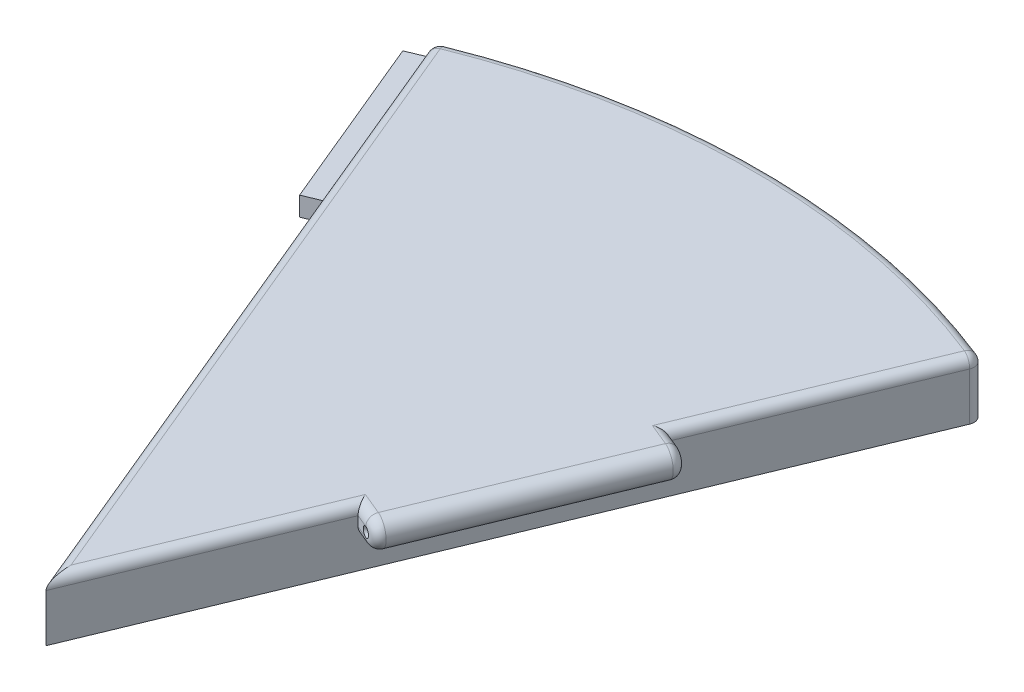
ISO-10303-21;
HEADER;
FILE_DESCRIPTION(('STEP AP214'),'2;1');
FILE_NAME('part.step','',(''),(''),'','','');
FILE_SCHEMA(('AUTOMOTIVE_DESIGN { 1 0 10303 214 1 1 1 1 }'));
ENDSEC;
DATA;
#1=APPLICATION_CONTEXT('core data for automotive mechanical design processes');
#2=APPLICATION_PROTOCOL_DEFINITION('international standard','automotive_design',2000,#1);
#3=PRODUCT_CONTEXT('',#1,'mechanical');
#4=PRODUCT('Part','Part','',(#3));
#5=PRODUCT_RELATED_PRODUCT_CATEGORY('part','',(#4));
#6=PRODUCT_DEFINITION_FORMATION('','',#4);
#7=PRODUCT_DEFINITION_CONTEXT('part definition',#1,'design');
#8=PRODUCT_DEFINITION('design','',#6,#7);
#9=PRODUCT_DEFINITION_SHAPE('','',#8);
#10=(LENGTH_UNIT() NAMED_UNIT(*) SI_UNIT(.MILLI.,.METRE.));
#11=(NAMED_UNIT(*) PLANE_ANGLE_UNIT() SI_UNIT($,.RADIAN.));
#12=(NAMED_UNIT(*) SI_UNIT($,.STERADIAN.) SOLID_ANGLE_UNIT());
#13=UNCERTAINTY_MEASURE_WITH_UNIT(LENGTH_MEASURE(1.E-05),#10,'distance_accuracy_value','');
#14=(GEOMETRIC_REPRESENTATION_CONTEXT(3) GLOBAL_UNCERTAINTY_ASSIGNED_CONTEXT((#13)) GLOBAL_UNIT_ASSIGNED_CONTEXT((#10,
#11,#12)) REPRESENTATION_CONTEXT('',''));
#15=CARTESIAN_POINT('',(0.,0.,0.));
#16=DIRECTION('',(0.,0.,1.));
#17=DIRECTION('',(1.,0.,0.));
#18=AXIS2_PLACEMENT_3D('',#15,#16,#17);
#19=CARTESIAN_POINT('',(0.,6.,0.));
#20=DIRECTION('',(-0.923461268672836,0.,0.383691653885194));
#21=DIRECTION('',(0.383691653885194,0.,0.923461268672836));
#22=AXIS2_PLACEMENT_3D('',#19,#20,#21);
#23=PLANE('',#22);
#24=DIRECTION('',(0.,1.,0.));
#25=VECTOR('',#24,1.);
#26=CARTESIAN_POINT('',(-20.7167566802569,5.,-49.8606686202791));
#27=LINE('',#26,#25);
#28=CARTESIAN_POINT('',(-20.7167566802569,3.,-49.8606686202791));
#29=VERTEX_POINT('',#28);
#30=CARTESIAN_POINT('',(-20.7167566802569,5.,-49.8606686202791));
#31=VERTEX_POINT('',#30);
#32=EDGE_CURVE('E59',#29,#31,#27,.T.);
#33=ORIENTED_EDGE('',*,*,#32,.F.);
#34=DIRECTION('',(0.383691653885194,0.,0.923461268672836));
#35=VECTOR('',#34,1.);
#36=CARTESIAN_POINT('',(-28.3905897579608,3.,-68.3298939937358));
#37=LINE('',#36,#35);
#38=CARTESIAN_POINT('',(-28.3905897579608,3.,-68.3298939937358));
#39=VERTEX_POINT('',#38);
#40=EDGE_CURVE('E462',#39,#29,#37,.T.);
#41=ORIENTED_EDGE('',*,*,#40,.F.);
#42=DIRECTION('',(0.,-1.,0.));
#43=VECTOR('',#42,1.);
#44=CARTESIAN_POINT('',(-28.3905897579608,6.,-68.3298939937358));
#45=LINE('',#44,#43);
#46=CARTESIAN_POINT('',(-28.3905897579608,0.,-68.3298939937358));
#47=VERTEX_POINT('',#46);
#48=EDGE_CURVE('E305',#39,#47,#45,.T.);
#49=ORIENTED_EDGE('',*,*,#48,.T.);
#50=DIRECTION('',(-0.383691653885194,0.,-0.923461268672836));
#51=VECTOR('',#50,1.);
#52=CARTESIAN_POINT('',(0.,0.,0.));
#53=LINE('',#52,#51);
#54=CARTESIAN_POINT('',(0.,0.,0.));
#55=VERTEX_POINT('',#54);
#56=EDGE_CURVE('E242',#55,#47,#53,.T.);
#57=ORIENTED_EDGE('',*,*,#56,.F.);
#58=DIRECTION('',(0.,-1.,0.));
#59=VECTOR('',#58,1.);
#60=CARTESIAN_POINT('',(0.,6.,0.));
#61=LINE('',#60,#59);
#62=CARTESIAN_POINT('',(0.,5.,0.));
#63=VERTEX_POINT('',#62);
#64=EDGE_CURVE('E249',#63,#55,#61,.T.);
#65=ORIENTED_EDGE('',*,*,#64,.F.);
#66=DIRECTION('',(-0.383691653885194,0.,-0.923461268672836));
#67=VECTOR('',#66,1.);
#68=CARTESIAN_POINT('',(0.,5.,0.));
#69=LINE('',#68,#67);
#70=EDGE_CURVE('E308',#63,#31,#69,.T.);
#71=ORIENTED_EDGE('',*,*,#70,.T.);
#72=EDGE_LOOP('',(#33,#41,#49,#57,#65,#71));
#73=FACE_BOUND('',#72,.T.);
#74=ADVANCED_FACE('F41',(#73),#23,.T.);
#75=CARTESIAN_POINT('',(0.,6.,0.));
#76=DIRECTION('',(0.,1.,0.));
#77=DIRECTION('',(0.,0.,1.));
#78=AXIS2_PLACEMENT_3D('',#75,#76,#77);
#79=PLANE('',#78);
#80=DIRECTION('',(-0.381674754894794,0.,0.924296695588597));
#81=VECTOR('',#80,1.);
#82=CARTESIAN_POINT('',(20.4701827881226,6.,-45.6423226470877));
#83=LINE('',#82,#81);
#84=CARTESIAN_POINT('',(20.0885080332278,6.,-44.7180259514991));
#85=VERTEX_POINT('',#84);
#86=CARTESIAN_POINT('',(11.3099886706475,6.,-23.4592019529613));
#87=VERTEX_POINT('',#86);
#88=EDGE_CURVE('E208',#85,#87,#83,.T.);
#89=ORIENTED_EDGE('',*,*,#88,.F.);
#90=DIRECTION('',(-0.924296695588597,0.,-0.381674754894794));
#91=VECTOR('',#90,1.);
#92=CARTESIAN_POINT('',(18.7020629898449,6.,-45.2905380838412));
#93=LINE('',#92,#91);
#94=CARTESIAN_POINT('',(17.7777662942563,6.,-45.672212838736));
#95=VERTEX_POINT('',#94);
#96=EDGE_CURVE('E302',#85,#95,#93,.T.);
#97=ORIENTED_EDGE('',*,*,#96,.T.);
#98=DIRECTION('',(-0.381674754894793,0.,0.924296695588597));
#99=VECTOR('',#98,1.);
#100=CARTESIAN_POINT('',(-0.924296695588594,6.,-0.381674754894792));
#101=LINE('',#100,#99);
#102=CARTESIAN_POINT('',(27.3170561654006,6.,-68.7733846953627));
#103=VERTEX_POINT('',#102);
#104=EDGE_CURVE('E299',#95,#103,#101,.F.);
#105=ORIENTED_EDGE('',*,*,#104,.T.);
#106=CARTESIAN_POINT('',(0.,6.,0.));
#107=DIRECTION('',(0.,1.,0.));
#108=DIRECTION('',(0.,0.,1.));
#109=AXIS2_PLACEMENT_3D('',#106,#107,#108);
#110=CIRCLE('',#109,73.9999999999999);
#111=CARTESIAN_POINT('',(-27.4671284892879,6.,-68.713585647621));
#112=VERTEX_POINT('',#111);
#113=EDGE_CURVE('E296',#103,#112,#110,.T.);
#114=ORIENTED_EDGE('',*,*,#113,.T.);
#115=DIRECTION('',(-0.383691653885194,0.,-0.923461268672836));
#116=VECTOR('',#115,1.);
#117=CARTESIAN_POINT('',(0.923461268672836,6.,-0.383691653885194));
#118=LINE('',#117,#116);
#119=CARTESIAN_POINT('',(-0.0028523259061616,6.,-2.61312437304142));
#120=VERTEX_POINT('',#119);
#121=EDGE_CURVE('E293',#112,#120,#118,.F.);
#122=ORIENTED_EDGE('',*,*,#121,.T.);
#123=DIRECTION('',(-0.381674754894793,0.,0.924296695588597));
#124=VECTOR('',#123,1.);
#125=CARTESIAN_POINT('',(-0.924296695588598,6.,-0.381674754894794));
#126=LINE('',#125,#124);
#127=CARTESIAN_POINT('',(8.99924693167603,6.,-24.4133888401983));
#128=VERTEX_POINT('',#127);
#129=EDGE_CURVE('E290',#120,#128,#126,.F.);
#130=ORIENTED_EDGE('',*,*,#129,.T.);
#131=DIRECTION('',(-0.924296695588597,0.,-0.381674754894794));
#132=VECTOR('',#131,1.);
#133=CARTESIAN_POINT('',(11.3099886706475,6.,-23.4592019529613));
#134=LINE('',#133,#132);
#135=EDGE_CURVE('E287',#128,#87,#134,.F.);
#136=ORIENTED_EDGE('',*,*,#135,.T.);
#137=EDGE_LOOP('',(#89,#97,#105,#114,#122,#130,#136));
#138=FACE_BOUND('',#137,.T.);
#139=ADVANCED_FACE('F413',(#138),#79,.T.);
#140=CARTESIAN_POINT('',(12.3147589591356,3.,-21.9623931250305));
#141=DIRECTION('',(0.,1.,0.));
#142=DIRECTION('',(0.,0.,1.));
#143=AXIS2_PLACEMENT_3D('',#140,#141,#142);
#144=PLANE('',#143);
#145=DIRECTION('',(0.381674754894794,0.,-0.924296695588597));
#146=VECTOR('',#145,1.);
#147=CARTESIAN_POINT('',(9.54186887236984,3.,-23.1074173897149));
#148=LINE('',#147,#146);
#149=CARTESIAN_POINT('',(9.92354362726463,3.,-24.0317140853035));
#150=VERTEX_POINT('',#149);
#151=CARTESIAN_POINT('',(18.7020629898449,3.,-45.2905380838412));
#152=VERTEX_POINT('',#151);
#153=EDGE_CURVE('E230',#150,#152,#148,.T.);
#154=ORIENTED_EDGE('',*,*,#153,.T.);
#155=DIRECTION('',(-0.924296695588597,0.,-0.381674754894794));
#156=VECTOR('',#155,1.);
#157=CARTESIAN_POINT('',(21.4749530766107,3.,-44.1455138191569));
#158=LINE('',#157,#156);
#159=CARTESIAN_POINT('',(20.0885080332278,3.,-44.7180259514991));
#160=VERTEX_POINT('',#159);
#161=EDGE_CURVE('E263',#152,#160,#158,.F.);
#162=ORIENTED_EDGE('',*,*,#161,.T.);
#163=DIRECTION('',(-0.381674754894794,0.,0.924296695588597));
#164=VECTOR('',#163,1.);
#165=CARTESIAN_POINT('',(20.4701827881226,3.,-45.6423226470877));
#166=LINE('',#165,#164);
#167=CARTESIAN_POINT('',(11.3099886706475,3.,-23.4592019529613));
#168=VERTEX_POINT('',#167);
#169=EDGE_CURVE('E213',#160,#168,#166,.T.);
#170=ORIENTED_EDGE('',*,*,#169,.T.);
#171=DIRECTION('',(-0.924296695588597,0.,-0.381674754894794));
#172=VECTOR('',#171,1.);
#173=CARTESIAN_POINT('',(12.6964337140304,3.,-22.8866898206191));
#174=LINE('',#173,#172);
#175=EDGE_CURVE('E260',#168,#150,#174,.T.);
#176=ORIENTED_EDGE('',*,*,#175,.T.);
#177=EDGE_LOOP('',(#154,#162,#170,#176));
#178=FACE_BOUND('',#177,.T.);
#179=ADVANCED_FACE('F386',(#178),#144,.F.);
#180=CARTESIAN_POINT('',(0.,6.,0.));
#181=DIRECTION('',(0.924296695588597,0.,0.381674754894793));
#182=DIRECTION('',(0.381674754894793,0.,-0.924296695588597));
#183=AXIS2_PLACEMENT_3D('',#180,#181,#182);
#184=PLANE('',#183);
#185=DIRECTION('',(0.,-1.,0.));
#186=VECTOR('',#185,1.);
#187=CARTESIAN_POINT('',(9.54186887236984,6.,-23.1074173897149));
#188=LINE('',#187,#186);
#189=CARTESIAN_POINT('',(9.54186887236984,5.,-23.1074173897149));
#190=VERTEX_POINT('',#189);
#191=CARTESIAN_POINT('',(9.54186887236984,4.,-23.1074173897149));
#192=VERTEX_POINT('',#191);
#193=EDGE_CURVE('E221',#190,#192,#188,.T.);
#194=ORIENTED_EDGE('',*,*,#193,.F.);
#195=DIRECTION('',(-0.381674754894793,0.,0.924296695588597));
#196=VECTOR('',#195,1.);
#197=CARTESIAN_POINT('',(0.,5.,0.));
#198=LINE('',#197,#196);
#199=EDGE_CURVE('E284',#190,#63,#198,.T.);
#200=ORIENTED_EDGE('',*,*,#199,.T.);
#201=ORIENTED_EDGE('',*,*,#64,.T.);
#202=DIRECTION('',(-0.381674754894793,0.,0.924296695588597));
#203=VECTOR('',#202,1.);
#204=CARTESIAN_POINT('',(0.,0.,0.));
#205=LINE('',#204,#203);
#206=CARTESIAN_POINT('',(28.2413528609892,0.,-68.3917099404679));
#207=VERTEX_POINT('',#206);
#208=EDGE_CURVE('E246',#207,#55,#205,.T.);
#209=ORIENTED_EDGE('',*,*,#208,.F.);
#210=DIRECTION('',(0.,-1.,0.));
#211=VECTOR('',#210,1.);
#212=CARTESIAN_POINT('',(28.2413528609892,6.,-68.3917099404679));
#213=LINE('',#212,#211);
#214=CARTESIAN_POINT('',(28.2413528609892,5.,-68.3917099404679));
#215=VERTEX_POINT('',#214);
#216=EDGE_CURVE('E278',#207,#215,#213,.F.);
#217=ORIENTED_EDGE('',*,*,#216,.T.);
#218=DIRECTION('',(-0.381674754894793,0.,0.924296695588597));
#219=VECTOR('',#218,1.);
#220=CARTESIAN_POINT('',(0.,5.,0.));
#221=LINE('',#220,#219);
#222=CARTESIAN_POINT('',(19.0837377447397,5.,-46.2148347794298));
#223=VERTEX_POINT('',#222);
#224=EDGE_CURVE('E281',#215,#223,#221,.T.);
#225=ORIENTED_EDGE('',*,*,#224,.T.);
#226=DIRECTION('',(0.,1.,0.));
#227=VECTOR('',#226,1.);
#228=CARTESIAN_POINT('',(19.0837377447397,6.,-46.2148347794298));
#229=LINE('',#228,#227);
#230=CARTESIAN_POINT('',(19.0837377447397,4.,-46.2148347794298));
#231=VERTEX_POINT('',#230);
#232=EDGE_CURVE('E234',#231,#223,#229,.T.);
#233=ORIENTED_EDGE('',*,*,#232,.F.);
#234=CARTESIAN_POINT('',(18.7020629898449,4.,-45.2905380838412));
#235=DIRECTION('',(0.924296695588597,0.,0.381674754894793));
#236=DIRECTION('',(0.381674754894793,0.,-0.924296695588597));
#237=AXIS2_PLACEMENT_3D('',#234,#235,#236);
#238=CIRCLE('',#237,1.);
#239=EDGE_CURVE('E51',#231,#152,#238,.F.);
#240=ORIENTED_EDGE('',*,*,#239,.T.);
#241=ORIENTED_EDGE('',*,*,#153,.F.);
#242=CARTESIAN_POINT('',(9.92354362726463,4.,-24.0317140853035));
#243=DIRECTION('',(0.924296695588597,0.,0.381674754894793));
#244=DIRECTION('',(0.381674754894793,0.,-0.924296695588597));
#245=AXIS2_PLACEMENT_3D('',#242,#243,#244);
#246=CIRCLE('',#245,1.);
#247=EDGE_CURVE('E11',#150,#192,#246,.F.);
#248=ORIENTED_EDGE('',*,*,#247,.T.);
#249=EDGE_LOOP('',(#194,#200,#201,#209,#217,#225,#233,#240,#241,#248));
#250=FACE_BOUND('',#249,.T.);
#251=ADVANCED_FACE('F391',(#250),#184,.T.);
#252=CARTESIAN_POINT('',(0.,6.,0.));
#253=DIRECTION('',(0.,-1.,0.));
#254=DIRECTION('',(0.,0.,-1.));
#255=AXIS2_PLACEMENT_3D('',#252,#253,#254);
#256=CYLINDRICAL_SURFACE('',#255,74.9999999999999);
#257=CARTESIAN_POINT('',(0.,5.,0.));
#258=DIRECTION('',(0.,1.,0.));
#259=DIRECTION('',(0.,0.,1.));
#260=AXIS2_PLACEMENT_3D('',#257,#258,#259);
#261=CIRCLE('',#260,74.9999999999999);
#262=CARTESIAN_POINT('',(-27.8383059013054,5.,-69.6421476158321));
#263=VERTEX_POINT('',#262);
#264=CARTESIAN_POINT('',(27.6862055730412,5.,-69.7027547588136));
#265=VERTEX_POINT('',#264);
#266=EDGE_CURVE('E314',#263,#265,#261,.F.);
#267=ORIENTED_EDGE('',*,*,#266,.T.);
#268=DIRECTION('',(0.,-1.,0.));
#269=VECTOR('',#268,1.);
#270=CARTESIAN_POINT('',(27.6862055730412,6.,-69.7027547588136));
#271=LINE('',#270,#269);
#272=CARTESIAN_POINT('',(27.6862055730412,0.,-69.7027547588136));
#273=VERTEX_POINT('',#272);
#274=EDGE_CURVE('E317',#265,#273,#271,.T.);
#275=ORIENTED_EDGE('',*,*,#274,.T.);
#276=CARTESIAN_POINT('',(0.,0.,0.));
#277=DIRECTION('',(0.,1.,0.));
#278=DIRECTION('',(0.,0.,1.));
#279=AXIS2_PLACEMENT_3D('',#276,#277,#278);
#280=CIRCLE('',#279,74.9999999999999);
#281=CARTESIAN_POINT('',(-27.8383059013054,0.,-69.6421476158321));
#282=VERTEX_POINT('',#281);
#283=EDGE_CURVE('E238',#282,#273,#280,.F.);
#284=ORIENTED_EDGE('',*,*,#283,.F.);
#285=DIRECTION('',(0.,-1.,0.));
#286=VECTOR('',#285,1.);
#287=CARTESIAN_POINT('',(-27.8383059013054,6.,-69.6421476158321));
#288=LINE('',#287,#286);
#289=EDGE_CURVE('E311',#282,#263,#288,.F.);
#290=ORIENTED_EDGE('',*,*,#289,.T.);
#291=EDGE_LOOP('',(#267,#275,#284,#290));
#292=FACE_BOUND('',#291,.T.);
#293=ADVANCED_FACE('F438',(#292),#256,.T.);
#294=CARTESIAN_POINT('',(0.,0.,0.));
#295=DIRECTION('',(0.,1.,0.));
#296=DIRECTION('',(0.,0.,1.));
#297=AXIS2_PLACEMENT_3D('',#294,#295,#296);
#298=PLANE('',#297);
#299=ORIENTED_EDGE('',*,*,#283,.T.);
#300=CARTESIAN_POINT('',(27.3170561654006,0.,-68.7733846953627));
#301=DIRECTION('',(0.,1.,0.));
#302=DIRECTION('',(0.,0.,1.));
#303=AXIS2_PLACEMENT_3D('',#300,#301,#302);
#304=CIRCLE('',#303,1.);
#305=EDGE_CURVE('E323',#273,#207,#304,.F.);
#306=ORIENTED_EDGE('',*,*,#305,.T.);
#307=ORIENTED_EDGE('',*,*,#208,.T.);
#308=ORIENTED_EDGE('',*,*,#56,.T.);
#309=CARTESIAN_POINT('',(-27.4671284892879,0.,-68.713585647621));
#310=DIRECTION('',(0.,1.,0.));
#311=DIRECTION('',(0.,0.,1.));
#312=AXIS2_PLACEMENT_3D('',#309,#310,#311);
#313=CIRCLE('',#312,1.);
#314=EDGE_CURVE('E320',#47,#282,#313,.F.);
#315=ORIENTED_EDGE('',*,*,#314,.T.);
#316=EDGE_LOOP('',(#299,#306,#307,#308,#315));
#317=FACE_BOUND('',#316,.T.);
#318=ADVANCED_FACE('F441',(#317),#298,.F.);
#319=CARTESIAN_POINT('',(12.3147589591356,6.,-21.9623931250305));
#320=DIRECTION('',(0.381674754894794,0.,-0.924296695588597));
#321=DIRECTION('',(-0.924296695588597,0.,-0.381674754894794));
#322=AXIS2_PLACEMENT_3D('',#319,#320,#321);
#323=PLANE('',#322);
#324=ORIENTED_EDGE('',*,*,#193,.T.);
#325=DIRECTION('',(-0.924296695588597,0.,-0.381674754894794));
#326=VECTOR('',#325,1.);
#327=CARTESIAN_POINT('',(12.3147589591356,4.,-21.9623931250305));
#328=LINE('',#327,#326);
#329=CARTESIAN_POINT('',(10.9283139157527,4.,-22.5349052573727));
#330=VERTEX_POINT('',#329);
#331=EDGE_CURVE('E275',#192,#330,#328,.F.);
#332=ORIENTED_EDGE('',*,*,#331,.T.);
#333=CARTESIAN_POINT('',(10.9283139157527,4.5,-22.5349052573727));
#334=DIRECTION('',(-0.381674754894794,0.,0.924296695588597));
#335=DIRECTION('',(0.924296695588597,0.,0.381674754894794));
#336=AXIS2_PLACEMENT_3D('',#333,#334,#335);
#337=CIRCLE('',#336,0.5);
#338=CARTESIAN_POINT('',(10.9283139157527,5.,-22.5349052573727));
#339=VERTEX_POINT('',#338);
#340=EDGE_CURVE('E223',#339,#330,#337,.T.);
#341=ORIENTED_EDGE('',*,*,#340,.F.);
#342=DIRECTION('',(-0.924296695588597,0.,-0.381674754894794));
#343=VECTOR('',#342,1.);
#344=CARTESIAN_POINT('',(9.54186887236984,5.,-23.1074173897149));
#345=LINE('',#344,#343);
#346=EDGE_CURVE('E272',#339,#190,#345,.T.);
#347=ORIENTED_EDGE('',*,*,#346,.T.);
#348=EDGE_LOOP('',(#324,#332,#341,#347));
#349=FACE_BOUND('',#348,.T.);
#350=ADVANCED_FACE('F460',(#349),#323,.F.);
#351=CARTESIAN_POINT('',(21.8566278315055,6.,-45.0698105147455));
#352=DIRECTION('',(-0.381674754894794,0.,0.924296695588597));
#353=DIRECTION('',(0.924296695588597,0.,0.381674754894794));
#354=AXIS2_PLACEMENT_3D('',#351,#352,#353);
#355=PLANE('',#354);
#356=CARTESIAN_POINT('',(20.4701827881226,4.5,-45.6423226470877));
#357=DIRECTION('',(-0.381674754894794,0.,0.924296695588597));
#358=DIRECTION('',(0.924296695588597,0.,0.381674754894794));
#359=AXIS2_PLACEMENT_3D('',#356,#357,#358);
#360=CIRCLE('',#359,0.5);
#361=CARTESIAN_POINT('',(20.4701827881226,5.,-45.6423226470877));
#362=VERTEX_POINT('',#361);
#363=CARTESIAN_POINT('',(20.4701827881226,4.,-45.6423226470877));
#364=VERTEX_POINT('',#363);
#365=EDGE_CURVE('E217',#362,#364,#360,.T.);
#366=ORIENTED_EDGE('',*,*,#365,.T.);
#367=DIRECTION('',(-0.924296695588597,0.,-0.381674754894794));
#368=VECTOR('',#367,1.);
#369=CARTESIAN_POINT('',(21.8566278315055,4.,-45.0698105147455));
#370=LINE('',#369,#368);
#371=EDGE_CURVE('E256',#364,#231,#370,.T.);
#372=ORIENTED_EDGE('',*,*,#371,.T.);
#373=ORIENTED_EDGE('',*,*,#232,.T.);
#374=DIRECTION('',(-0.924296695588597,0.,-0.381674754894794));
#375=VECTOR('',#374,1.);
#376=CARTESIAN_POINT('',(20.4701827881226,5.,-45.6423226470877));
#377=LINE('',#376,#375);
#378=EDGE_CURVE('E253',#223,#362,#377,.F.);
#379=ORIENTED_EDGE('',*,*,#378,.T.);
#380=EDGE_LOOP('',(#366,#372,#373,#379));
#381=FACE_BOUND('',#380,.T.);
#382=ADVANCED_FACE('F397',(#381),#355,.F.);
#383=CARTESIAN_POINT('',(20.4701827881226,4.5,-45.6423226470877));
#384=DIRECTION('',(-0.381674754894794,0.,0.924296695588597));
#385=DIRECTION('',(0.924296695588597,0.,0.381674754894794));
#386=AXIS2_PLACEMENT_3D('',#383,#384,#385);
#387=CYLINDRICAL_SURFACE('',#386,0.5);
#388=ORIENTED_EDGE('',*,*,#365,.F.);
#389=EDGE_CURVE('E222',#364,#362,#360,.T.);
#390=ORIENTED_EDGE('',*,*,#389,.F.);
#391=EDGE_LOOP('',(#388,#390));
#392=FACE_BOUND('',#391,.T.);
#393=ORIENTED_EDGE('',*,*,#340,.T.);
#394=EDGE_CURVE('E212',#330,#339,#337,.T.);
#395=ORIENTED_EDGE('',*,*,#394,.T.);
#396=EDGE_LOOP('',(#393,#395));
#397=FACE_BOUND('',#396,.T.);
#398=ADVANCED_FACE('F467',(#392,#397),#387,.F.);
#399=CARTESIAN_POINT('',(20.4701827881226,4.5,-45.6423226470877));
#400=DIRECTION('',(-0.381674754894794,0.,0.924296695588597));
#401=DIRECTION('',(0.924296695588597,0.,0.381674754894794));
#402=AXIS2_PLACEMENT_3D('',#399,#400,#401);
#403=CYLINDRICAL_SURFACE('',#402,1.5);
#404=ORIENTED_EDGE('',*,*,#169,.F.);
#405=CARTESIAN_POINT('',(20.0885080332278,4.5,-44.7180259514991));
#406=DIRECTION('',(-0.381674754894794,0.,0.924296695588597));
#407=DIRECTION('',(0.924296695588597,0.,0.381674754894794));
#408=AXIS2_PLACEMENT_3D('',#405,#406,#407);
#409=CIRCLE('',#408,1.5);
#410=EDGE_CURVE('E269',#160,#85,#409,.T.);
#411=ORIENTED_EDGE('',*,*,#410,.T.);
#412=ORIENTED_EDGE('',*,*,#88,.T.);
#413=CARTESIAN_POINT('',(11.3099886706475,4.5,-23.4592019529613));
#414=DIRECTION('',(0.381674754894794,0.,-0.924296695588597));
#415=DIRECTION('',(-0.924296695588597,0.,-0.381674754894794));
#416=AXIS2_PLACEMENT_3D('',#413,#414,#415);
#417=CIRCLE('',#416,1.5);
#418=EDGE_CURVE('E266',#87,#168,#417,.T.);
#419=ORIENTED_EDGE('',*,*,#418,.T.);
#420=EDGE_LOOP('',(#404,#411,#412,#419));
#421=FACE_BOUND('',#420,.T.);
#422=ADVANCED_FACE('F410',(#421),#403,.T.);
#423=CARTESIAN_POINT('',(12.6964337140304,4.,-22.8866898206191));
#424=DIRECTION('',(-0.924296695588597,0.,-0.381674754894794));
#425=DIRECTION('',(-0.381674754894794,0.,0.924296695588597));
#426=AXIS2_PLACEMENT_3D('',#423,#424,#425);
#427=CYLINDRICAL_SURFACE('',#426,1.);
#428=ORIENTED_EDGE('',*,*,#247,.F.);
#429=ORIENTED_EDGE('',*,*,#175,.F.);
#430=CARTESIAN_POINT('',(11.3099886706475,4.,-23.4592019529613));
#431=DIRECTION('',(0.924296695588597,0.,0.381674754894792));
#432=DIRECTION('',(0.381674754894792,0.,-0.924296695588597));
#433=AXIS2_PLACEMENT_3D('',#430,#431,#432);
#434=CIRCLE('',#433,1.);
#435=EDGE_CURVE('E45',#330,#168,#434,.T.);
#436=ORIENTED_EDGE('',*,*,#435,.F.);
#437=ORIENTED_EDGE('',*,*,#331,.F.);
#438=EDGE_LOOP('',(#428,#429,#436,#437));
#439=FACE_BOUND('',#438,.T.);
#440=ADVANCED_FACE('F43',(#439),#427,.T.);
#441=CARTESIAN_POINT('',(11.3099886706475,4.5,-23.4592019529613));
#442=DIRECTION('',(0.381674754894794,0.,-0.924296695588597));
#443=DIRECTION('',(-0.924296695588597,0.,-0.381674754894794));
#444=AXIS2_PLACEMENT_3D('',#441,#442,#443);
#445=DEGENERATE_TOROIDAL_SURFACE('',#444,0.5,1.,.T.);
#446=ORIENTED_EDGE('',*,*,#435,.T.);
#447=ORIENTED_EDGE('',*,*,#418,.F.);
#448=CARTESIAN_POINT('',(11.3099886706475,5.,-23.4592019529613));
#449=DIRECTION('',(-0.924296695588597,0.,-0.381674754894793));
#450=DIRECTION('',(-0.381674754894794,0.,0.924296695588597));
#451=AXIS2_PLACEMENT_3D('',#448,#449,#450);
#452=CIRCLE('',#451,1.);
#453=EDGE_CURVE('E366',#339,#87,#452,.T.);
#454=ORIENTED_EDGE('',*,*,#453,.F.);
#455=ORIENTED_EDGE('',*,*,#394,.F.);
#456=EDGE_LOOP('',(#446,#447,#454,#455));
#457=FACE_BOUND('',#456,.T.);
#458=ADVANCED_FACE('F379',(#457),#445,.T.);
#459=CARTESIAN_POINT('',(12.6964337140304,5.,-22.8866898206191));
#460=DIRECTION('',(0.924296695588597,0.,0.381674754894794));
#461=DIRECTION('',(0.381674754894794,0.,-0.924296695588597));
#462=AXIS2_PLACEMENT_3D('',#459,#460,#461);
#463=CYLINDRICAL_SURFACE('',#462,1.);
#464=ORIENTED_EDGE('',*,*,#453,.T.);
#465=ORIENTED_EDGE('',*,*,#135,.F.);
#466=CARTESIAN_POINT('',(8.99924693167603,5.,-24.4133888401983));
#467=DIRECTION('',(-0.923461268672837,0.,0.383691653885193));
#468=DIRECTION('',(0.383691653885193,0.,0.923461268672837));
#469=AXIS2_PLACEMENT_3D('',#466,#467,#468);
#470=ELLIPSE('',#469,1.4142135623731,1.);
#471=EDGE_CURVE('E363',#190,#128,#470,.T.);
#472=ORIENTED_EDGE('',*,*,#471,.F.);
#473=ORIENTED_EDGE('',*,*,#346,.F.);
#474=EDGE_LOOP('',(#464,#465,#472,#473));
#475=FACE_BOUND('',#474,.T.);
#476=ADVANCED_FACE('F457',(#475),#463,.T.);
#477=CARTESIAN_POINT('',(-0.924296695588597,5.,-0.381674754894793));
#478=DIRECTION('',(-0.381674754894793,0.,0.924296695588597));
#479=DIRECTION('',(0.924296695588597,0.,0.381674754894793));
#480=AXIS2_PLACEMENT_3D('',#477,#478,#479);
#481=CYLINDRICAL_SURFACE('',#480,1.);
#482=ORIENTED_EDGE('',*,*,#471,.T.);
#483=ORIENTED_EDGE('',*,*,#129,.F.);
#484=CARTESIAN_POINT('',(-0.00285232590616134,5.,-2.61312437304142));
#485=DIRECTION('',(-0.999999404272364,0.,0.00109153786799378));
#486=DIRECTION('',(-0.00109153786799375,0.,-0.999999404272364));
#487=AXIS2_PLACEMENT_3D('',#484,#485,#486);
#488=ELLIPSE('',#487,2.61312592975275,1.);
#489=EDGE_CURVE('E359',#63,#120,#488,.T.);
#490=ORIENTED_EDGE('',*,*,#489,.F.);
#491=ORIENTED_EDGE('',*,*,#199,.F.);
#492=EDGE_LOOP('',(#482,#483,#490,#491));
#493=FACE_BOUND('',#492,.T.);
#494=ADVANCED_FACE('F454',(#493),#481,.T.);
#495=CARTESIAN_POINT('',(0.923461268672836,5.,-0.383691653885194));
#496=DIRECTION('',(-0.383691653885194,0.,-0.923461268672836));
#497=DIRECTION('',(-0.923461268672836,0.,0.383691653885194));
#498=AXIS2_PLACEMENT_3D('',#495,#496,#497);
#499=CYLINDRICAL_SURFACE('',#498,1.);
#500=ORIENTED_EDGE('',*,*,#489,.T.);
#501=ORIENTED_EDGE('',*,*,#121,.F.);
#502=CARTESIAN_POINT('',(-27.4671284892879,5.,-68.713585647621));
#503=DIRECTION('',(-0.383691653885188,0.,-0.923461268672839));
#504=DIRECTION('',(-0.923461268672839,0.,0.383691653885188));
#505=AXIS2_PLACEMENT_3D('',#502,#503,#504);
#506=CIRCLE('',#505,1.);
#507=CARTESIAN_POINT('',(-28.3905897579608,5.,-68.3298939937358));
#508=VERTEX_POINT('',#507);
#509=EDGE_CURVE('E355',#508,#112,#506,.T.);
#510=ORIENTED_EDGE('',*,*,#509,.F.);
#511=DIRECTION('',(-0.383691653885194,0.,-0.923461268672836));
#512=VECTOR('',#511,1.);
#513=CARTESIAN_POINT('',(-28.3905897579608,5.,-68.3298939937358));
#514=LINE('',#513,#512);
#515=EDGE_CURVE('E67',#31,#508,#514,.T.);
#516=ORIENTED_EDGE('',*,*,#515,.F.);
#517=ORIENTED_EDGE('',*,*,#70,.F.);
#518=EDGE_LOOP('',(#500,#501,#510,#516,#517));
#519=FACE_BOUND('',#518,.T.);
#520=ADVANCED_FACE('F450',(#519),#499,.T.);
#521=CARTESIAN_POINT('',(-27.4671284892879,6.,-68.713585647621));
#522=DIRECTION('',(0.,-1.,0.));
#523=DIRECTION('',(0.,0.,-1.));
#524=AXIS2_PLACEMENT_3D('',#521,#522,#523);
#525=CYLINDRICAL_SURFACE('',#524,1.);
#526=ORIENTED_EDGE('',*,*,#314,.F.);
#527=ORIENTED_EDGE('',*,*,#48,.F.);
#528=EDGE_CURVE('E195',#508,#39,#45,.T.);
#529=ORIENTED_EDGE('',*,*,#528,.F.);
#530=CARTESIAN_POINT('',(-27.4671284892879,5.,-68.713585647621));
#531=DIRECTION('',(0.,1.,0.));
#532=DIRECTION('',(0.,0.,1.));
#533=AXIS2_PLACEMENT_3D('',#530,#531,#532);
#534=CIRCLE('',#533,1.);
#535=EDGE_CURVE('E351',#263,#508,#534,.T.);
#536=ORIENTED_EDGE('',*,*,#535,.F.);
#537=ORIENTED_EDGE('',*,*,#289,.F.);
#538=EDGE_LOOP('',(#526,#527,#529,#536,#537));
#539=FACE_BOUND('',#538,.T.);
#540=ADVANCED_FACE('F446',(#539),#525,.T.);
#541=CARTESIAN_POINT('',(-27.4671284892879,5.,-68.713585647621));
#542=DIRECTION('',(0.,0.,1.));
#543=DIRECTION('',(1.,0.,0.));
#544=AXIS2_PLACEMENT_3D('',#541,#542,#543);
#545=SPHERICAL_SURFACE('',#544,1.);
#546=ORIENTED_EDGE('',*,*,#535,.T.);
#547=ORIENTED_EDGE('',*,*,#509,.T.);
#548=CARTESIAN_POINT('',(-27.4671284892879,5.,-68.713585647621));
#549=DIRECTION('',(-0.928561968211096,0.,0.371177412017401));
#550=DIRECTION('',(0.371177412017401,0.,0.928561968211096));
#551=AXIS2_PLACEMENT_3D('',#548,#549,#550);
#552=CIRCLE('',#551,1.);
#553=EDGE_CURVE('E347',#263,#112,#552,.F.);
#554=ORIENTED_EDGE('',*,*,#553,.F.);
#555=EDGE_LOOP('',(#546,#547,#554));
#556=FACE_BOUND('',#555,.T.);
#557=ADVANCED_FACE('F449',(#556),#545,.T.);
#558=CARTESIAN_POINT('',(0.,5.,0.));
#559=DIRECTION('',(0.,1.,0.));
#560=DIRECTION('',(0.,0.,1.));
#561=AXIS2_PLACEMENT_3D('',#558,#559,#560);
#562=TOROIDAL_SURFACE('',#561,73.9999999999999,1.);
#563=ORIENTED_EDGE('',*,*,#553,.T.);
#564=ORIENTED_EDGE('',*,*,#113,.F.);
#565=CARTESIAN_POINT('',(27.3170561654006,5.,-68.7733846953627));
#566=DIRECTION('',(0.929370063450846,0.,0.369149407640551));
#567=DIRECTION('',(0.369149407640551,0.,-0.929370063450846));
#568=AXIS2_PLACEMENT_3D('',#565,#566,#567);
#569=CIRCLE('',#568,1.);
#570=EDGE_CURVE('E343',#265,#103,#569,.T.);
#571=ORIENTED_EDGE('',*,*,#570,.F.);
#572=ORIENTED_EDGE('',*,*,#266,.F.);
#573=EDGE_LOOP('',(#563,#564,#571,#572));
#574=FACE_BOUND('',#573,.T.);
#575=ADVANCED_FACE('F425',(#574),#562,.T.);
#576=CARTESIAN_POINT('',(27.3170561654006,6.,-68.7733846953627));
#577=DIRECTION('',(0.,-1.,0.));
#578=DIRECTION('',(0.,0.,-1.));
#579=AXIS2_PLACEMENT_3D('',#576,#577,#578);
#580=CYLINDRICAL_SURFACE('',#579,1.);
#581=ORIENTED_EDGE('',*,*,#305,.F.);
#582=ORIENTED_EDGE('',*,*,#274,.F.);
#583=CARTESIAN_POINT('',(27.3170561654006,5.,-68.7733846953627));
#584=DIRECTION('',(0.,1.,0.));
#585=DIRECTION('',(0.,0.,1.));
#586=AXIS2_PLACEMENT_3D('',#583,#584,#585);
#587=CIRCLE('',#586,1.);
#588=EDGE_CURVE('E339',#215,#265,#587,.T.);
#589=ORIENTED_EDGE('',*,*,#588,.F.);
#590=ORIENTED_EDGE('',*,*,#216,.F.);
#591=EDGE_LOOP('',(#581,#582,#589,#590));
#592=FACE_BOUND('',#591,.T.);
#593=ADVANCED_FACE('F435',(#592),#580,.T.);
#594=CARTESIAN_POINT('',(27.3170561654006,5.,-68.7733846953627));
#595=DIRECTION('',(0.,0.,1.));
#596=DIRECTION('',(1.,0.,0.));
#597=AXIS2_PLACEMENT_3D('',#594,#595,#596);
#598=SPHERICAL_SURFACE('',#597,1.);
#599=ORIENTED_EDGE('',*,*,#588,.T.);
#600=ORIENTED_EDGE('',*,*,#570,.T.);
#601=CARTESIAN_POINT('',(27.3170561654006,5.,-68.7733846953627));
#602=DIRECTION('',(0.381674754894798,0.,-0.924296695588595));
#603=DIRECTION('',(-0.924296695588595,0.,-0.381674754894798));
#604=AXIS2_PLACEMENT_3D('',#601,#602,#603);
#605=CIRCLE('',#604,1.);
#606=EDGE_CURVE('E335',#215,#103,#605,.F.);
#607=ORIENTED_EDGE('',*,*,#606,.F.);
#608=EDGE_LOOP('',(#599,#600,#607));
#609=FACE_BOUND('',#608,.T.);
#610=ADVANCED_FACE('F429',(#609),#598,.T.);
#611=CARTESIAN_POINT('',(-0.924296695588597,5.,-0.381674754894793));
#612=DIRECTION('',(-0.381674754894793,0.,0.924296695588597));
#613=DIRECTION('',(0.924296695588597,0.,0.381674754894793));
#614=AXIS2_PLACEMENT_3D('',#611,#612,#613);
#615=CYLINDRICAL_SURFACE('',#614,1.);
#616=ORIENTED_EDGE('',*,*,#606,.T.);
#617=ORIENTED_EDGE('',*,*,#104,.F.);
#618=CARTESIAN_POINT('',(17.7777662942563,5.,-45.672212838736));
#619=DIRECTION('',(0.383691653885193,0.,0.923461268672837));
#620=DIRECTION('',(-0.923461268672837,0.,0.383691653885193));
#621=AXIS2_PLACEMENT_3D('',#618,#619,#620);
#622=ELLIPSE('',#621,1.41421356237309,1.);
#623=EDGE_CURVE('E331',#223,#95,#622,.T.);
#624=ORIENTED_EDGE('',*,*,#623,.F.);
#625=ORIENTED_EDGE('',*,*,#224,.F.);
#626=EDGE_LOOP('',(#616,#617,#624,#625));
#627=FACE_BOUND('',#626,.T.);
#628=ADVANCED_FACE('F419',(#627),#615,.T.);
#629=CARTESIAN_POINT('',(18.7020629898449,5.,-45.2905380838412));
#630=DIRECTION('',(0.924296695588597,0.,0.381674754894794));
#631=DIRECTION('',(0.381674754894794,0.,-0.924296695588597));
#632=AXIS2_PLACEMENT_3D('',#629,#630,#631);
#633=CYLINDRICAL_SURFACE('',#632,1.);
#634=ORIENTED_EDGE('',*,*,#623,.T.);
#635=ORIENTED_EDGE('',*,*,#96,.F.);
#636=CARTESIAN_POINT('',(20.0885080332278,5.,-44.7180259514991));
#637=DIRECTION('',(0.924296695588597,0.,0.381674754894794));
#638=DIRECTION('',(0.381674754894794,0.,-0.924296695588597));
#639=AXIS2_PLACEMENT_3D('',#636,#637,#638);
#640=CIRCLE('',#639,1.);
#641=EDGE_CURVE('E202',#362,#85,#640,.T.);
#642=ORIENTED_EDGE('',*,*,#641,.F.);
#643=ORIENTED_EDGE('',*,*,#378,.F.);
#644=EDGE_LOOP('',(#634,#635,#642,#643));
#645=FACE_BOUND('',#644,.T.);
#646=ADVANCED_FACE('F416',(#645),#633,.T.);
#647=CARTESIAN_POINT('',(20.0885080332278,4.5,-44.7180259514991));
#648=DIRECTION('',(-0.381674754894794,0.,0.924296695588597));
#649=DIRECTION('',(0.924296695588597,0.,0.381674754894794));
#650=AXIS2_PLACEMENT_3D('',#647,#648,#649);
#651=DEGENERATE_TOROIDAL_SURFACE('',#650,0.5,1.,.T.);
#652=ORIENTED_EDGE('',*,*,#641,.T.);
#653=ORIENTED_EDGE('',*,*,#410,.F.);
#654=CARTESIAN_POINT('',(20.0885080332278,4.,-44.7180259514991));
#655=DIRECTION('',(-0.924296695588597,0.,-0.381674754894794));
#656=DIRECTION('',(-0.381674754894794,0.,0.924296695588597));
#657=AXIS2_PLACEMENT_3D('',#654,#655,#656);
#658=CIRCLE('',#657,1.);
#659=EDGE_CURVE('E197',#364,#160,#658,.T.);
#660=ORIENTED_EDGE('',*,*,#659,.F.);
#661=ORIENTED_EDGE('',*,*,#389,.T.);
#662=EDGE_LOOP('',(#652,#653,#660,#661));
#663=FACE_BOUND('',#662,.T.);
#664=ADVANCED_FACE('F407',(#663),#651,.T.);
#665=CARTESIAN_POINT('',(21.4749530766107,4.,-44.1455138191569));
#666=DIRECTION('',(-0.924296695588597,0.,-0.381674754894794));
#667=DIRECTION('',(-0.381674754894794,0.,0.924296695588597));
#668=AXIS2_PLACEMENT_3D('',#665,#666,#667);
#669=CYLINDRICAL_SURFACE('',#668,1.);
#670=ORIENTED_EDGE('',*,*,#659,.T.);
#671=ORIENTED_EDGE('',*,*,#161,.F.);
#672=ORIENTED_EDGE('',*,*,#239,.F.);
#673=ORIENTED_EDGE('',*,*,#371,.F.);
#674=EDGE_LOOP('',(#670,#671,#672,#673));
#675=FACE_BOUND('',#674,.T.);
#676=ADVANCED_FACE('F395',(#675),#669,.T.);
#677=CARTESIAN_POINT('',(-30.2375122953065,5.,-67.5625106859654));
#678=DIRECTION('',(0.383691653885194,0.,0.923461268672836));
#679=DIRECTION('',(0.923461268672836,0.,-0.383691653885194));
#680=AXIS2_PLACEMENT_3D('',#677,#678,#679);
#681=PLANE('',#680);
#682=ORIENTED_EDGE('',*,*,#528,.T.);
#683=DIRECTION('',(0.923461268672836,0.,-0.383691653885194));
#684=VECTOR('',#683,1.);
#685=CARTESIAN_POINT('',(-30.2375122953065,3.,-67.5625106859654));
#686=LINE('',#685,#684);
#687=CARTESIAN_POINT('',(-30.2375122953065,3.,-67.5625106859654));
#688=VERTEX_POINT('',#687);
#689=EDGE_CURVE('E175',#688,#39,#686,.T.);
#690=ORIENTED_EDGE('',*,*,#689,.F.);
#691=DIRECTION('',(0.,-1.,0.));
#692=VECTOR('',#691,1.);
#693=CARTESIAN_POINT('',(-30.2375122953065,5.,-67.5625106859654));
#694=LINE('',#693,#692);
#695=CARTESIAN_POINT('',(-30.2375122953065,5.,-67.5625106859654));
#696=VERTEX_POINT('',#695);
#697=EDGE_CURVE('E183',#696,#688,#694,.T.);
#698=ORIENTED_EDGE('',*,*,#697,.F.);
#699=DIRECTION('',(0.923461268672836,0.,-0.383691653885194));
#700=VECTOR('',#699,1.);
#701=CARTESIAN_POINT('',(-30.2375122953065,5.,-67.5625106859654));
#702=LINE('',#701,#700);
#703=EDGE_CURVE('E712',#696,#508,#702,.T.);
#704=ORIENTED_EDGE('',*,*,#703,.T.);
#705=EDGE_LOOP('',(#682,#690,#698,#704));
#706=FACE_BOUND('',#705,.T.);
#707=ADVANCED_FACE('F194',(#706),#681,.F.);
#708=CARTESIAN_POINT('',(-30.2375122953065,3.,-67.5625106859654));
#709=DIRECTION('',(0.,1.,0.));
#710=DIRECTION('',(0.,0.,1.));
#711=AXIS2_PLACEMENT_3D('',#708,#709,#710);
#712=PLANE('',#711);
#713=ORIENTED_EDGE('',*,*,#40,.T.);
#714=DIRECTION('',(0.923461268672836,0.,-0.383691653885194));
#715=VECTOR('',#714,1.);
#716=CARTESIAN_POINT('',(-22.5636792176026,3.,-49.0932853125087));
#717=LINE('',#716,#715);
#718=CARTESIAN_POINT('',(-22.5636792176026,3.,-49.0932853125087));
#719=VERTEX_POINT('',#718);
#720=EDGE_CURVE('E178',#719,#29,#717,.T.);
#721=ORIENTED_EDGE('',*,*,#720,.F.);
#722=DIRECTION('',(0.383691653885194,0.,0.923461268672836));
#723=VECTOR('',#722,1.);
#724=CARTESIAN_POINT('',(-30.2375122953065,3.,-67.5625106859654));
#725=LINE('',#724,#723);
#726=EDGE_CURVE('E171',#688,#719,#725,.T.);
#727=ORIENTED_EDGE('',*,*,#726,.F.);
#728=ORIENTED_EDGE('',*,*,#689,.T.);
#729=EDGE_LOOP('',(#713,#721,#727,#728));
#730=FACE_BOUND('',#729,.T.);
#731=ADVANCED_FACE('F173',(#730),#712,.F.);
#732=CARTESIAN_POINT('',(-22.5636792176026,5.,-49.0932853125087));
#733=DIRECTION('',(-0.383691653885194,0.,-0.923461268672836));
#734=DIRECTION('',(-0.923461268672836,0.,0.383691653885194));
#735=AXIS2_PLACEMENT_3D('',#732,#733,#734);
#736=PLANE('',#735);
#737=ORIENTED_EDGE('',*,*,#32,.T.);
#738=DIRECTION('',(0.923461268672836,0.,-0.383691653885194));
#739=VECTOR('',#738,1.);
#740=CARTESIAN_POINT('',(-22.5636792176026,5.,-49.0932853125087));
#741=LINE('',#740,#739);
#742=CARTESIAN_POINT('',(-22.5636792176026,5.,-49.0932853125087));
#743=VERTEX_POINT('',#742);
#744=EDGE_CURVE('E204',#743,#31,#741,.T.);
#745=ORIENTED_EDGE('',*,*,#744,.F.);
#746=DIRECTION('',(0.,1.,0.));
#747=VECTOR('',#746,1.);
#748=CARTESIAN_POINT('',(-22.5636792176026,5.,-49.0932853125087));
#749=LINE('',#748,#747);
#750=EDGE_CURVE('E182',#719,#743,#749,.T.);
#751=ORIENTED_EDGE('',*,*,#750,.F.);
#752=ORIENTED_EDGE('',*,*,#720,.T.);
#753=EDGE_LOOP('',(#737,#745,#751,#752));
#754=FACE_BOUND('',#753,.T.);
#755=ADVANCED_FACE('F668',(#754),#736,.F.);
#756=CARTESIAN_POINT('',(-30.2375122953065,5.,-67.5625106859654));
#757=DIRECTION('',(0.,-1.,0.));
#758=DIRECTION('',(0.,0.,-1.));
#759=AXIS2_PLACEMENT_3D('',#756,#757,#758);
#760=PLANE('',#759);
#761=ORIENTED_EDGE('',*,*,#515,.T.);
#762=ORIENTED_EDGE('',*,*,#703,.F.);
#763=DIRECTION('',(-0.383691653885194,0.,-0.923461268672836));
#764=VECTOR('',#763,1.);
#765=CARTESIAN_POINT('',(-30.2375122953065,5.,-67.5625106859654));
#766=LINE('',#765,#764);
#767=EDGE_CURVE('E188',#743,#696,#766,.T.);
#768=ORIENTED_EDGE('',*,*,#767,.F.);
#769=ORIENTED_EDGE('',*,*,#744,.T.);
#770=EDGE_LOOP('',(#761,#762,#768,#769));
#771=FACE_BOUND('',#770,.T.);
#772=ADVANCED_FACE('F676',(#771),#760,.F.);
#773=CARTESIAN_POINT('',(-1.84692253734568,0.,0.767383307770391));
#774=DIRECTION('',(-0.923461268672836,0.,0.383691653885194));
#775=DIRECTION('',(0.383691653885194,0.,0.923461268672836));
#776=AXIS2_PLACEMENT_3D('',#773,#774,#775);
#777=PLANE('',#776);
#778=ORIENTED_EDGE('',*,*,#697,.T.);
#779=ORIENTED_EDGE('',*,*,#726,.T.);
#780=ORIENTED_EDGE('',*,*,#750,.T.);
#781=ORIENTED_EDGE('',*,*,#767,.T.);
#782=EDGE_LOOP('',(#778,#779,#780,#781));
#783=FACE_BOUND('',#782,.T.);
#784=ADVANCED_FACE('F186',(#783),#777,.T.);
#785=CLOSED_SHELL('',(#74,#139,#179,#251,#293,#318,#350,#382,#398,#422,#440,#458,#476,#494,#520,
#540,#557,#575,#593,#610,#628,#646,#664,#676,#707,#731,#755,#772,#784));
#786=MANIFOLD_SOLID_BREP('B2',#785);
#787=ADVANCED_BREP_SHAPE_REPRESENTATION('',(#18,#786),#14);
#788=SHAPE_DEFINITION_REPRESENTATION(#9,#787);
ENDSEC;
END-ISO-10303-21;
